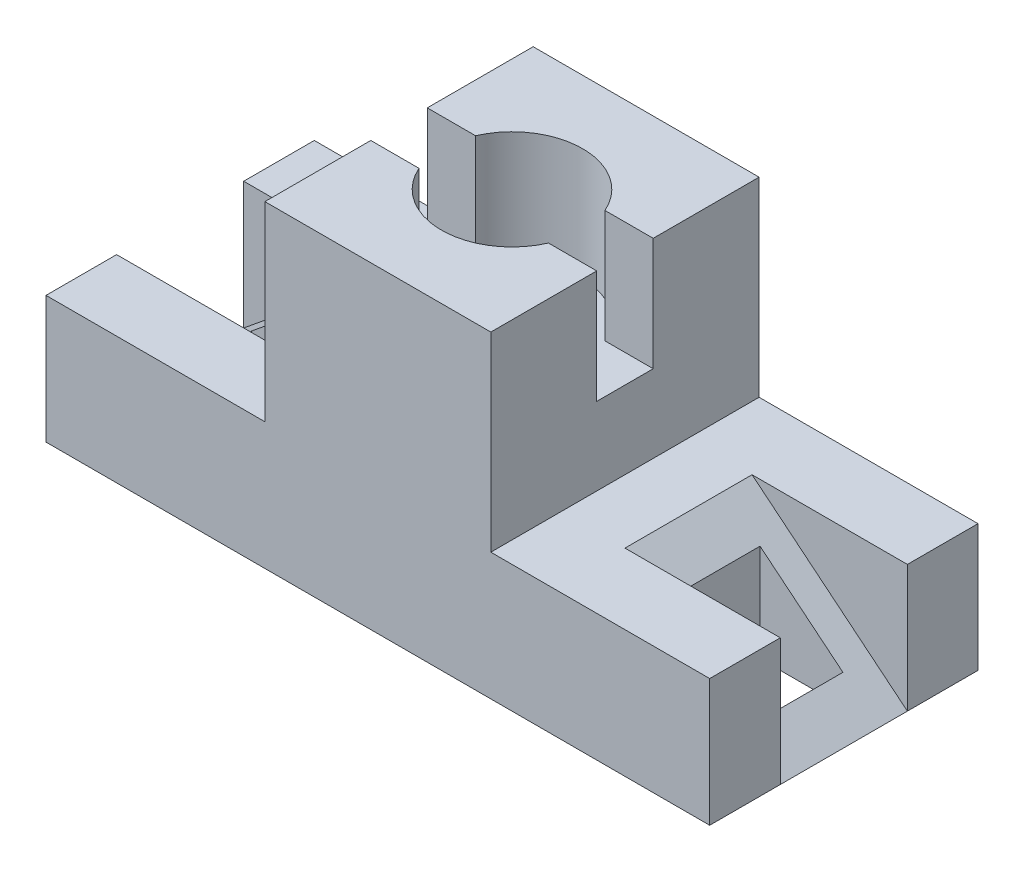
ISO-10303-21;
HEADER;
FILE_DESCRIPTION(('STEP AP214'),'2;1');
FILE_NAME('part.step','',(''),(''),'','','');
FILE_SCHEMA(('AUTOMOTIVE_DESIGN { 1 0 10303 214 1 1 1 1 }'));
ENDSEC;
DATA;
#1=APPLICATION_CONTEXT('core data for automotive mechanical design processes');
#2=APPLICATION_PROTOCOL_DEFINITION('international standard','automotive_design',2000,#1);
#3=PRODUCT_CONTEXT('',#1,'mechanical');
#4=PRODUCT('Part','Part','',(#3));
#5=PRODUCT_RELATED_PRODUCT_CATEGORY('part','',(#4));
#6=PRODUCT_DEFINITION_FORMATION('','',#4);
#7=PRODUCT_DEFINITION_CONTEXT('part definition',#1,'design');
#8=PRODUCT_DEFINITION('design','',#6,#7);
#9=PRODUCT_DEFINITION_SHAPE('','',#8);
#10=(LENGTH_UNIT() NAMED_UNIT(*) SI_UNIT(.MILLI.,.METRE.));
#11=(NAMED_UNIT(*) PLANE_ANGLE_UNIT() SI_UNIT($,.RADIAN.));
#12=(NAMED_UNIT(*) SI_UNIT($,.STERADIAN.) SOLID_ANGLE_UNIT());
#13=UNCERTAINTY_MEASURE_WITH_UNIT(LENGTH_MEASURE(1.E-05),#10,'distance_accuracy_value','');
#14=(GEOMETRIC_REPRESENTATION_CONTEXT(3) GLOBAL_UNCERTAINTY_ASSIGNED_CONTEXT((#13)) GLOBAL_UNIT_ASSIGNED_CONTEXT((#10,
#11,#12)) REPRESENTATION_CONTEXT('',''));
#15=CARTESIAN_POINT('',(0.,0.,0.));
#16=DIRECTION('',(0.,0.,1.));
#17=DIRECTION('',(1.,0.,0.));
#18=AXIS2_PLACEMENT_3D('',#15,#16,#17);
#19=CARTESIAN_POINT('',(94.,0.,38.));
#20=DIRECTION('',(0.,1.,0.));
#21=DIRECTION('',(0.,0.,1.));
#22=AXIS2_PLACEMENT_3D('',#19,#20,#21);
#23=PLANE('',#22);
#24=DIRECTION('',(1.,0.,0.));
#25=VECTOR('',#24,1.);
#26=CARTESIAN_POINT('',(94.,0.,0.));
#27=LINE('',#26,#25);
#28=CARTESIAN_POINT('',(0.,0.,0.));
#29=VERTEX_POINT('',#28);
#30=CARTESIAN_POINT('',(94.,0.,0.));
#31=VERTEX_POINT('',#30);
#32=EDGE_CURVE('E343',#29,#31,#27,.T.);
#33=ORIENTED_EDGE('',*,*,#32,.T.);
#34=DIRECTION('',(0.,0.,-1.));
#35=VECTOR('',#34,1.);
#36=CARTESIAN_POINT('',(94.,0.,38.));
#37=LINE('',#36,#35);
#38=CARTESIAN_POINT('',(94.,0.,10.));
#39=VERTEX_POINT('',#38);
#40=EDGE_CURVE('E423',#39,#31,#37,.T.);
#41=ORIENTED_EDGE('',*,*,#40,.F.);
#42=DIRECTION('',(0.,0.,-1.));
#43=VECTOR('',#42,1.);
#44=CARTESIAN_POINT('',(94.,0.,10.));
#45=LINE('',#44,#43);
#46=CARTESIAN_POINT('',(94.,0.,28.));
#47=VERTEX_POINT('',#46);
#48=EDGE_CURVE('E252',#47,#39,#45,.T.);
#49=ORIENTED_EDGE('',*,*,#48,.F.);
#50=CARTESIAN_POINT('',(94.,0.,38.));
#51=VERTEX_POINT('',#50);
#52=EDGE_CURVE('E424',#51,#47,#37,.T.);
#53=ORIENTED_EDGE('',*,*,#52,.F.);
#54=DIRECTION('',(1.,0.,0.));
#55=VECTOR('',#54,1.);
#56=CARTESIAN_POINT('',(94.,0.,38.));
#57=LINE('',#56,#55);
#58=CARTESIAN_POINT('',(0.,0.,38.));
#59=VERTEX_POINT('',#58);
#60=EDGE_CURVE('E359',#59,#51,#57,.T.);
#61=ORIENTED_EDGE('',*,*,#60,.F.);
#62=DIRECTION('',(0.,0.,-1.));
#63=VECTOR('',#62,1.);
#64=CARTESIAN_POINT('',(0.,0.,38.));
#65=LINE('',#64,#63);
#66=CARTESIAN_POINT('',(0.,0.,28.));
#67=VERTEX_POINT('',#66);
#68=EDGE_CURVE('E398',#59,#67,#65,.T.);
#69=ORIENTED_EDGE('',*,*,#68,.T.);
#70=DIRECTION('',(0.,0.,-1.));
#71=VECTOR('',#70,1.);
#72=CARTESIAN_POINT('',(0.,0.,10.));
#73=LINE('',#72,#71);
#74=CARTESIAN_POINT('',(0.,0.,10.));
#75=VERTEX_POINT('',#74);
#76=EDGE_CURVE('E290',#67,#75,#73,.T.);
#77=ORIENTED_EDGE('',*,*,#76,.T.);
#78=EDGE_CURVE('E377',#75,#29,#65,.T.);
#79=ORIENTED_EDGE('',*,*,#78,.T.);
#80=EDGE_LOOP('',(#33,#41,#49,#53,#61,#69,#77,#79));
#81=FACE_BOUND('',#80,.T.);
#82=DIRECTION('',(1.,0.,0.));
#83=VECTOR('',#82,1.);
#84=CARTESIAN_POINT('',(94.,0.,24.));
#85=LINE('',#84,#83);
#86=CARTESIAN_POINT('',(5.13,0.,24.));
#87=VERTEX_POINT('',#86);
#88=CARTESIAN_POINT('',(16.87,0.,24.));
#89=VERTEX_POINT('',#88);
#90=EDGE_CURVE('E278',#87,#89,#85,.T.);
#91=ORIENTED_EDGE('',*,*,#90,.T.);
#92=DIRECTION('',(0.,0.,-1.));
#93=VECTOR('',#92,1.);
#94=CARTESIAN_POINT('',(16.87,0.,38.));
#95=LINE('',#94,#93);
#96=CARTESIAN_POINT('',(16.87,0.,14.));
#97=VERTEX_POINT('',#96);
#98=EDGE_CURVE('E281',#89,#97,#95,.T.);
#99=ORIENTED_EDGE('',*,*,#98,.T.);
#100=DIRECTION('',(-1.,0.,0.));
#101=VECTOR('',#100,1.);
#102=CARTESIAN_POINT('',(94.,0.,14.));
#103=LINE('',#102,#101);
#104=CARTESIAN_POINT('',(5.13,0.,14.));
#105=VERTEX_POINT('',#104);
#106=EDGE_CURVE('E265',#97,#105,#103,.T.);
#107=ORIENTED_EDGE('',*,*,#106,.T.);
#108=DIRECTION('',(0.,0.,1.));
#109=VECTOR('',#108,1.);
#110=CARTESIAN_POINT('',(5.13,0.,38.));
#111=LINE('',#110,#109);
#112=EDGE_CURVE('E275',#105,#87,#111,.T.);
#113=ORIENTED_EDGE('',*,*,#112,.T.);
#114=EDGE_LOOP('',(#91,#99,#107,#113));
#115=FACE_BOUND('',#114,.T.);
#116=DIRECTION('',(0.,0.,-1.));
#117=VECTOR('',#116,1.);
#118=CARTESIAN_POINT('',(77.13,0.,38.));
#119=LINE('',#118,#117);
#120=CARTESIAN_POINT('',(77.13,0.,24.));
#121=VERTEX_POINT('',#120);
#122=CARTESIAN_POINT('',(77.13,0.,14.));
#123=VERTEX_POINT('',#122);
#124=EDGE_CURVE('E236',#121,#123,#119,.T.);
#125=ORIENTED_EDGE('',*,*,#124,.F.);
#126=DIRECTION('',(-1.,0.,0.));
#127=VECTOR('',#126,1.);
#128=CARTESIAN_POINT('',(94.,0.,24.));
#129=LINE('',#128,#127);
#130=CARTESIAN_POINT('',(88.87,0.,24.));
#131=VERTEX_POINT('',#130);
#132=EDGE_CURVE('E225',#131,#121,#129,.T.);
#133=ORIENTED_EDGE('',*,*,#132,.F.);
#134=DIRECTION('',(0.,0.,1.));
#135=VECTOR('',#134,1.);
#136=CARTESIAN_POINT('',(88.87,0.,38.));
#137=LINE('',#136,#135);
#138=CARTESIAN_POINT('',(88.87,0.,14.));
#139=VERTEX_POINT('',#138);
#140=EDGE_CURVE('E230',#139,#131,#137,.T.);
#141=ORIENTED_EDGE('',*,*,#140,.F.);
#142=DIRECTION('',(1.,0.,0.));
#143=VECTOR('',#142,1.);
#144=CARTESIAN_POINT('',(94.,0.,14.));
#145=LINE('',#144,#143);
#146=EDGE_CURVE('E242',#123,#139,#145,.T.);
#147=ORIENTED_EDGE('',*,*,#146,.F.);
#148=EDGE_LOOP('',(#125,#133,#141,#147));
#149=FACE_BOUND('',#148,.T.);
#150=ADVANCED_FACE('F33',(#81,#115,#149),#23,.F.);
#151=CARTESIAN_POINT('',(94.,0.,0.));
#152=DIRECTION('',(-0.633237790257263,-0.773957299203321,0.));
#153=DIRECTION('',(-0.773957299203321,0.633237790257263,0.));
#154=AXIS2_PLACEMENT_3D('',#151,#152,#153);
#155=PLANE('',#154);
#156=DIRECTION('',(0.,0.,1.));
#157=VECTOR('',#156,1.);
#158=CARTESIAN_POINT('',(72.,18.,28.));
#159=LINE('',#158,#157);
#160=CARTESIAN_POINT('',(72.,18.,10.));
#161=VERTEX_POINT('',#160);
#162=CARTESIAN_POINT('',(72.,18.,28.));
#163=VERTEX_POINT('',#162);
#164=EDGE_CURVE('E243',#161,#163,#159,.T.);
#165=ORIENTED_EDGE('',*,*,#164,.T.);
#166=DIRECTION('',(0.773957299203321,-0.633237790257263,0.));
#167=VECTOR('',#166,1.);
#168=CARTESIAN_POINT('',(94.,0.,28.));
#169=LINE('',#168,#167);
#170=EDGE_CURVE('E254',#163,#47,#169,.T.);
#171=ORIENTED_EDGE('',*,*,#170,.T.);
#172=ORIENTED_EDGE('',*,*,#48,.T.);
#173=DIRECTION('',(-0.773957299203321,0.633237790257263,0.));
#174=VECTOR('',#173,1.);
#175=CARTESIAN_POINT('',(94.,0.,10.));
#176=LINE('',#175,#174);
#177=EDGE_CURVE('E246',#39,#161,#176,.T.);
#178=ORIENTED_EDGE('',*,*,#177,.T.);
#179=EDGE_LOOP('',(#165,#171,#172,#178));
#180=FACE_BOUND('',#179,.T.);
#181=DIRECTION('',(0.,0.,1.));
#182=VECTOR('',#181,1.);
#183=CARTESIAN_POINT('',(77.13,13.8027272727273,0.));
#184=LINE('',#183,#182);
#185=CARTESIAN_POINT('',(77.13,13.8027272727273,14.));
#186=VERTEX_POINT('',#185);
#187=CARTESIAN_POINT('',(77.13,13.8027272727273,24.));
#188=VERTEX_POINT('',#187);
#189=EDGE_CURVE('E11',#186,#188,#184,.T.);
#190=ORIENTED_EDGE('',*,*,#189,.F.);
#191=DIRECTION('',(-0.773957299203321,0.633237790257263,0.));
#192=VECTOR('',#191,1.);
#193=CARTESIAN_POINT('',(94.,0.,14.));
#194=LINE('',#193,#192);
#195=CARTESIAN_POINT('',(88.87,4.19727272727272,14.));
#196=VERTEX_POINT('',#195);
#197=EDGE_CURVE('E40',#196,#186,#194,.T.);
#198=ORIENTED_EDGE('',*,*,#197,.F.);
#199=DIRECTION('',(0.,0.,-1.));
#200=VECTOR('',#199,1.);
#201=CARTESIAN_POINT('',(88.87,4.19727272727273,0.));
#202=LINE('',#201,#200);
#203=CARTESIAN_POINT('',(88.87,4.19727272727274,24.));
#204=VERTEX_POINT('',#203);
#205=EDGE_CURVE('E452',#204,#196,#202,.T.);
#206=ORIENTED_EDGE('',*,*,#205,.F.);
#207=DIRECTION('',(0.773957299203321,-0.633237790257263,0.));
#208=VECTOR('',#207,1.);
#209=CARTESIAN_POINT('',(94.,0.,24.));
#210=LINE('',#209,#208);
#211=EDGE_CURVE('E450',#188,#204,#210,.T.);
#212=ORIENTED_EDGE('',*,*,#211,.F.);
#213=EDGE_LOOP('',(#190,#198,#206,#212));
#214=FACE_BOUND('',#213,.T.);
#215=ADVANCED_FACE('F462',(#180,#214),#155,.F.);
#216=CARTESIAN_POINT('',(94.,18.,38.));
#217=DIRECTION('',(-1.,0.,0.));
#218=DIRECTION('',(0.,0.,1.));
#219=AXIS2_PLACEMENT_3D('',#216,#217,#218);
#220=PLANE('',#219);
#221=DIRECTION('',(0.,-1.,0.));
#222=VECTOR('',#221,1.);
#223=CARTESIAN_POINT('',(94.,18.,28.));
#224=LINE('',#223,#222);
#225=CARTESIAN_POINT('',(94.,18.,28.));
#226=VERTEX_POINT('',#225);
#227=EDGE_CURVE('E259',#226,#47,#224,.T.);
#228=ORIENTED_EDGE('',*,*,#227,.F.);
#229=DIRECTION('',(0.,0.,-1.));
#230=VECTOR('',#229,1.);
#231=CARTESIAN_POINT('',(94.,18.,38.));
#232=LINE('',#231,#230);
#233=CARTESIAN_POINT('',(94.,18.,38.));
#234=VERTEX_POINT('',#233);
#235=EDGE_CURVE('E420',#234,#226,#232,.T.);
#236=ORIENTED_EDGE('',*,*,#235,.F.);
#237=DIRECTION('',(0.,1.,0.));
#238=VECTOR('',#237,1.);
#239=CARTESIAN_POINT('',(94.,18.,38.));
#240=LINE('',#239,#238);
#241=EDGE_CURVE('E362',#51,#234,#240,.T.);
#242=ORIENTED_EDGE('',*,*,#241,.F.);
#243=ORIENTED_EDGE('',*,*,#52,.T.);
#244=EDGE_LOOP('',(#228,#236,#242,#243));
#245=FACE_BOUND('',#244,.T.);
#246=ADVANCED_FACE('F480',(#245),#220,.F.);
#247=DIRECTION('',(0.,1.,0.));
#248=VECTOR('',#247,1.);
#249=CARTESIAN_POINT('',(94.,18.,10.));
#250=LINE('',#249,#248);
#251=CARTESIAN_POINT('',(94.,18.,10.));
#252=VERTEX_POINT('',#251);
#253=EDGE_CURVE('E257',#39,#252,#250,.T.);
#254=ORIENTED_EDGE('',*,*,#253,.F.);
#255=ORIENTED_EDGE('',*,*,#40,.T.);
#256=DIRECTION('',(0.,1.,0.));
#257=VECTOR('',#256,1.);
#258=CARTESIAN_POINT('',(94.,18.,0.));
#259=LINE('',#258,#257);
#260=CARTESIAN_POINT('',(94.,18.,0.));
#261=VERTEX_POINT('',#260);
#262=EDGE_CURVE('E380',#31,#261,#259,.T.);
#263=ORIENTED_EDGE('',*,*,#262,.T.);
#264=EDGE_CURVE('E419',#252,#261,#232,.T.);
#265=ORIENTED_EDGE('',*,*,#264,.F.);
#266=EDGE_LOOP('',(#254,#255,#263,#265));
#267=FACE_BOUND('',#266,.T.);
#268=ADVANCED_FACE('F587',(#267),#220,.F.);
#269=CARTESIAN_POINT('',(63.,18.,38.));
#270=DIRECTION('',(0.,-1.,0.));
#271=DIRECTION('',(0.,0.,-1.));
#272=AXIS2_PLACEMENT_3D('',#269,#270,#271);
#273=PLANE('',#272);
#274=DIRECTION('',(1.,0.,0.));
#275=VECTOR('',#274,1.);
#276=CARTESIAN_POINT('',(63.,18.,28.));
#277=LINE('',#276,#275);
#278=EDGE_CURVE('E448',#163,#226,#277,.T.);
#279=ORIENTED_EDGE('',*,*,#278,.F.);
#280=ORIENTED_EDGE('',*,*,#164,.F.);
#281=DIRECTION('',(-1.,0.,0.));
#282=VECTOR('',#281,1.);
#283=CARTESIAN_POINT('',(63.,18.,10.));
#284=LINE('',#283,#282);
#285=EDGE_CURVE('E445',#252,#161,#284,.T.);
#286=ORIENTED_EDGE('',*,*,#285,.F.);
#287=ORIENTED_EDGE('',*,*,#264,.T.);
#288=DIRECTION('',(-1.,0.,0.));
#289=VECTOR('',#288,1.);
#290=CARTESIAN_POINT('',(63.,18.,0.));
#291=LINE('',#290,#289);
#292=CARTESIAN_POINT('',(63.,18.,0.));
#293=VERTEX_POINT('',#292);
#294=EDGE_CURVE('E383',#261,#293,#291,.T.);
#295=ORIENTED_EDGE('',*,*,#294,.T.);
#296=DIRECTION('',(0.,0.,-1.));
#297=VECTOR('',#296,1.);
#298=CARTESIAN_POINT('',(63.,18.,38.));
#299=LINE('',#298,#297);
#300=CARTESIAN_POINT('',(63.,18.,38.));
#301=VERTEX_POINT('',#300);
#302=EDGE_CURVE('E416',#301,#293,#299,.T.);
#303=ORIENTED_EDGE('',*,*,#302,.F.);
#304=DIRECTION('',(-1.,0.,0.));
#305=VECTOR('',#304,1.);
#306=CARTESIAN_POINT('',(63.,18.,38.));
#307=LINE('',#306,#305);
#308=EDGE_CURVE('E365',#234,#301,#307,.T.);
#309=ORIENTED_EDGE('',*,*,#308,.F.);
#310=ORIENTED_EDGE('',*,*,#235,.T.);
#311=EDGE_LOOP('',(#279,#280,#286,#287,#295,#303,#309,#310));
#312=FACE_BOUND('',#311,.T.);
#313=ADVANCED_FACE('F585',(#312),#273,.F.);
#314=CARTESIAN_POINT('',(0.,0.,38.));
#315=DIRECTION('',(1.,0.,0.));
#316=DIRECTION('',(0.,0.,-1.));
#317=AXIS2_PLACEMENT_3D('',#314,#315,#316);
#318=PLANE('',#317);
#319=ORIENTED_EDGE('',*,*,#78,.F.);
#320=DIRECTION('',(0.,1.,0.));
#321=VECTOR('',#320,1.);
#322=CARTESIAN_POINT('',(0.,0.,10.));
#323=LINE('',#322,#321);
#324=CARTESIAN_POINT('',(0.,18.,10.));
#325=VERTEX_POINT('',#324);
#326=EDGE_CURVE('E430',#75,#325,#323,.T.);
#327=ORIENTED_EDGE('',*,*,#326,.T.);
#328=DIRECTION('',(0.,0.,-1.));
#329=VECTOR('',#328,1.);
#330=CARTESIAN_POINT('',(0.,18.,38.));
#331=LINE('',#330,#329);
#332=CARTESIAN_POINT('',(0.,18.,0.));
#333=VERTEX_POINT('',#332);
#334=EDGE_CURVE('E401',#325,#333,#331,.T.);
#335=ORIENTED_EDGE('',*,*,#334,.T.);
#336=DIRECTION('',(0.,-1.,0.));
#337=VECTOR('',#336,1.);
#338=CARTESIAN_POINT('',(0.,0.,0.));
#339=LINE('',#338,#337);
#340=EDGE_CURVE('E363',#333,#29,#339,.T.);
#341=ORIENTED_EDGE('',*,*,#340,.T.);
#342=EDGE_LOOP('',(#319,#327,#335,#341));
#343=FACE_BOUND('',#342,.T.);
#344=ADVANCED_FACE('F568',(#343),#318,.F.);
#345=CARTESIAN_POINT('',(31.,45.,38.));
#346=DIRECTION('',(0.,-1.,0.));
#347=DIRECTION('',(0.,0.,-1.));
#348=AXIS2_PLACEMENT_3D('',#345,#346,#347);
#349=PLANE('',#348);
#350=DIRECTION('',(-1.,0.,0.));
#351=VECTOR('',#350,1.);
#352=CARTESIAN_POINT('',(0.,45.,23.));
#353=LINE('',#352,#351);
#354=CARTESIAN_POINT('',(37.8348486100883,45.,23.));
#355=VERTEX_POINT('',#354);
#356=CARTESIAN_POINT('',(31.,45.,23.));
#357=VERTEX_POINT('',#356);
#358=EDGE_CURVE('E302',#355,#357,#353,.T.);
#359=ORIENTED_EDGE('',*,*,#358,.T.);
#360=DIRECTION('',(0.,0.,-1.));
#361=VECTOR('',#360,1.);
#362=CARTESIAN_POINT('',(31.,45.,38.));
#363=LINE('',#362,#361);
#364=CARTESIAN_POINT('',(31.,45.,38.));
#365=VERTEX_POINT('',#364);
#366=EDGE_CURVE('E409',#365,#357,#363,.T.);
#367=ORIENTED_EDGE('',*,*,#366,.F.);
#368=DIRECTION('',(-1.,0.,0.));
#369=VECTOR('',#368,1.);
#370=CARTESIAN_POINT('',(31.,45.,38.));
#371=LINE('',#370,#369);
#372=CARTESIAN_POINT('',(63.,45.,38.));
#373=VERTEX_POINT('',#372);
#374=EDGE_CURVE('E369',#373,#365,#371,.T.);
#375=ORIENTED_EDGE('',*,*,#374,.F.);
#376=DIRECTION('',(0.,0.,-1.));
#377=VECTOR('',#376,1.);
#378=CARTESIAN_POINT('',(63.,45.,38.));
#379=LINE('',#378,#377);
#380=CARTESIAN_POINT('',(63.,45.,23.));
#381=VERTEX_POINT('',#380);
#382=EDGE_CURVE('E413',#373,#381,#379,.T.);
#383=ORIENTED_EDGE('',*,*,#382,.T.);
#384=DIRECTION('',(-1.,0.,0.));
#385=VECTOR('',#384,1.);
#386=CARTESIAN_POINT('',(0.,45.,23.));
#387=LINE('',#386,#385);
#388=CARTESIAN_POINT('',(56.1651513899117,45.,23.));
#389=VERTEX_POINT('',#388);
#390=EDGE_CURVE('E331',#381,#389,#387,.T.);
#391=ORIENTED_EDGE('',*,*,#390,.T.);
#392=CARTESIAN_POINT('',(47.,45.,19.));
#393=DIRECTION('',(0.,1.,0.));
#394=DIRECTION('',(0.,0.,1.));
#395=AXIS2_PLACEMENT_3D('',#392,#393,#394);
#396=CIRCLE('',#395,10.);
#397=EDGE_CURVE('E328',#355,#389,#396,.T.);
#398=ORIENTED_EDGE('',*,*,#397,.F.);
#399=EDGE_LOOP('',(#359,#367,#375,#383,#391,#398));
#400=FACE_BOUND('',#399,.T.);
#401=ADVANCED_FACE('F577',(#400),#349,.F.);
#402=CARTESIAN_POINT('',(31.,18.,38.));
#403=DIRECTION('',(1.,0.,0.));
#404=DIRECTION('',(0.,0.,-1.));
#405=AXIS2_PLACEMENT_3D('',#402,#403,#404);
#406=PLANE('',#405);
#407=DIRECTION('',(0.,1.,0.));
#408=VECTOR('',#407,1.);
#409=CARTESIAN_POINT('',(31.,29.,23.));
#410=LINE('',#409,#408);
#411=CARTESIAN_POINT('',(31.,29.,23.));
#412=VERTEX_POINT('',#411);
#413=EDGE_CURVE('E341',#412,#357,#410,.T.);
#414=ORIENTED_EDGE('',*,*,#413,.F.);
#415=DIRECTION('',(0.,0.,1.));
#416=VECTOR('',#415,1.);
#417=CARTESIAN_POINT('',(31.,29.,0.));
#418=LINE('',#417,#416);
#419=CARTESIAN_POINT('',(31.,29.,15.));
#420=VERTEX_POINT('',#419);
#421=EDGE_CURVE('E322',#420,#412,#418,.T.);
#422=ORIENTED_EDGE('',*,*,#421,.F.);
#423=DIRECTION('',(0.,1.,0.));
#424=VECTOR('',#423,1.);
#425=CARTESIAN_POINT('',(31.,29.,15.));
#426=LINE('',#425,#424);
#427=CARTESIAN_POINT('',(31.,45.,15.));
#428=VERTEX_POINT('',#427);
#429=EDGE_CURVE('E344',#420,#428,#426,.T.);
#430=ORIENTED_EDGE('',*,*,#429,.T.);
#431=CARTESIAN_POINT('',(31.,45.,0.));
#432=VERTEX_POINT('',#431);
#433=EDGE_CURVE('E408',#428,#432,#363,.T.);
#434=ORIENTED_EDGE('',*,*,#433,.T.);
#435=DIRECTION('',(0.,-1.,0.));
#436=VECTOR('',#435,1.);
#437=CARTESIAN_POINT('',(31.,18.,0.));
#438=LINE('',#437,#436);
#439=CARTESIAN_POINT('',(31.,18.,0.));
#440=VERTEX_POINT('',#439);
#441=EDGE_CURVE('E391',#432,#440,#438,.T.);
#442=ORIENTED_EDGE('',*,*,#441,.T.);
#443=DIRECTION('',(0.,0.,-1.));
#444=VECTOR('',#443,1.);
#445=CARTESIAN_POINT('',(31.,18.,38.));
#446=LINE('',#445,#444);
#447=CARTESIAN_POINT('',(31.,18.,38.));
#448=VERTEX_POINT('',#447);
#449=EDGE_CURVE('E405',#448,#440,#446,.T.);
#450=ORIENTED_EDGE('',*,*,#449,.F.);
#451=DIRECTION('',(0.,-1.,0.));
#452=VECTOR('',#451,1.);
#453=CARTESIAN_POINT('',(31.,18.,38.));
#454=LINE('',#453,#452);
#455=EDGE_CURVE('E371',#365,#448,#454,.T.);
#456=ORIENTED_EDGE('',*,*,#455,.F.);
#457=ORIENTED_EDGE('',*,*,#366,.T.);
#458=EDGE_LOOP('',(#414,#422,#430,#434,#442,#450,#456,#457));
#459=FACE_BOUND('',#458,.T.);
#460=ADVANCED_FACE('F573',(#459),#406,.F.);
#461=CARTESIAN_POINT('',(63.,45.,38.));
#462=DIRECTION('',(-1.,0.,0.));
#463=DIRECTION('',(0.,0.,1.));
#464=AXIS2_PLACEMENT_3D('',#461,#462,#463);
#465=PLANE('',#464);
#466=CARTESIAN_POINT('',(63.,45.,15.));
#467=VERTEX_POINT('',#466);
#468=CARTESIAN_POINT('',(63.,45.,0.));
#469=VERTEX_POINT('',#468);
#470=EDGE_CURVE('E412',#467,#469,#379,.T.);
#471=ORIENTED_EDGE('',*,*,#470,.F.);
#472=DIRECTION('',(0.,1.,0.));
#473=VECTOR('',#472,1.);
#474=CARTESIAN_POINT('',(63.,29.,15.));
#475=LINE('',#474,#473);
#476=CARTESIAN_POINT('',(63.,29.,15.));
#477=VERTEX_POINT('',#476);
#478=EDGE_CURVE('E351',#477,#467,#475,.T.);
#479=ORIENTED_EDGE('',*,*,#478,.F.);
#480=DIRECTION('',(0.,0.,-1.));
#481=VECTOR('',#480,1.);
#482=CARTESIAN_POINT('',(63.,29.,0.));
#483=LINE('',#482,#481);
#484=CARTESIAN_POINT('',(63.,29.,23.));
#485=VERTEX_POINT('',#484);
#486=EDGE_CURVE('E311',#485,#477,#483,.T.);
#487=ORIENTED_EDGE('',*,*,#486,.F.);
#488=DIRECTION('',(0.,1.,0.));
#489=VECTOR('',#488,1.);
#490=CARTESIAN_POINT('',(63.,29.,23.));
#491=LINE('',#490,#489);
#492=EDGE_CURVE('E353',#485,#381,#491,.T.);
#493=ORIENTED_EDGE('',*,*,#492,.T.);
#494=ORIENTED_EDGE('',*,*,#382,.F.);
#495=DIRECTION('',(0.,1.,0.));
#496=VECTOR('',#495,1.);
#497=CARTESIAN_POINT('',(63.,45.,38.));
#498=LINE('',#497,#496);
#499=EDGE_CURVE('E367',#301,#373,#498,.T.);
#500=ORIENTED_EDGE('',*,*,#499,.F.);
#501=ORIENTED_EDGE('',*,*,#302,.T.);
#502=DIRECTION('',(0.,1.,0.));
#503=VECTOR('',#502,1.);
#504=CARTESIAN_POINT('',(63.,45.,0.));
#505=LINE('',#504,#503);
#506=EDGE_CURVE('E385',#293,#469,#505,.T.);
#507=ORIENTED_EDGE('',*,*,#506,.T.);
#508=EDGE_LOOP('',(#471,#479,#487,#493,#494,#500,#501,#507));
#509=FACE_BOUND('',#508,.T.);
#510=ADVANCED_FACE('F576',(#509),#465,.F.);
#511=ORIENTED_EDGE('',*,*,#433,.F.);
#512=DIRECTION('',(-1.,0.,0.));
#513=VECTOR('',#512,1.);
#514=CARTESIAN_POINT('',(0.,45.,15.));
#515=LINE('',#514,#513);
#516=CARTESIAN_POINT('',(37.8348486100883,45.,15.));
#517=VERTEX_POINT('',#516);
#518=EDGE_CURVE('E306',#517,#428,#515,.T.);
#519=ORIENTED_EDGE('',*,*,#518,.F.);
#520=CARTESIAN_POINT('',(47.,45.,19.));
#521=DIRECTION('',(0.,1.,0.));
#522=DIRECTION('',(0.,0.,1.));
#523=AXIS2_PLACEMENT_3D('',#520,#521,#522);
#524=CIRCLE('',#523,10.);
#525=CARTESIAN_POINT('',(56.1651513899117,45.,15.));
#526=VERTEX_POINT('',#525);
#527=EDGE_CURVE('E337',#526,#517,#524,.T.);
#528=ORIENTED_EDGE('',*,*,#527,.F.);
#529=DIRECTION('',(-1.,0.,0.));
#530=VECTOR('',#529,1.);
#531=CARTESIAN_POINT('',(0.,45.,15.));
#532=LINE('',#531,#530);
#533=EDGE_CURVE('E334',#467,#526,#532,.T.);
#534=ORIENTED_EDGE('',*,*,#533,.F.);
#535=ORIENTED_EDGE('',*,*,#470,.T.);
#536=DIRECTION('',(-1.,0.,0.));
#537=VECTOR('',#536,1.);
#538=CARTESIAN_POINT('',(31.,45.,0.));
#539=LINE('',#538,#537);
#540=EDGE_CURVE('E388',#469,#432,#539,.T.);
#541=ORIENTED_EDGE('',*,*,#540,.T.);
#542=EDGE_LOOP('',(#511,#519,#528,#534,#535,#541));
#543=FACE_BOUND('',#542,.T.);
#544=ADVANCED_FACE('F571',(#543),#349,.F.);
#545=CARTESIAN_POINT('',(0.,18.,38.));
#546=DIRECTION('',(0.,-1.,0.));
#547=DIRECTION('',(0.,0.,-1.));
#548=AXIS2_PLACEMENT_3D('',#545,#546,#547);
#549=PLANE('',#548);
#550=ORIENTED_EDGE('',*,*,#334,.F.);
#551=DIRECTION('',(1.,0.,0.));
#552=VECTOR('',#551,1.);
#553=CARTESIAN_POINT('',(0.,18.,10.));
#554=LINE('',#553,#552);
#555=CARTESIAN_POINT('',(22.,18.,10.));
#556=VERTEX_POINT('',#555);
#557=EDGE_CURVE('E299',#325,#556,#554,.T.);
#558=ORIENTED_EDGE('',*,*,#557,.T.);
#559=DIRECTION('',(0.,0.,1.));
#560=VECTOR('',#559,1.);
#561=CARTESIAN_POINT('',(22.,18.,28.));
#562=LINE('',#561,#560);
#563=CARTESIAN_POINT('',(22.,18.,28.));
#564=VERTEX_POINT('',#563);
#565=EDGE_CURVE('E284',#556,#564,#562,.T.);
#566=ORIENTED_EDGE('',*,*,#565,.T.);
#567=DIRECTION('',(-1.,0.,0.));
#568=VECTOR('',#567,1.);
#569=CARTESIAN_POINT('',(0.,18.,28.));
#570=LINE('',#569,#568);
#571=CARTESIAN_POINT('',(0.,18.,28.));
#572=VERTEX_POINT('',#571);
#573=EDGE_CURVE('E296',#564,#572,#570,.T.);
#574=ORIENTED_EDGE('',*,*,#573,.T.);
#575=CARTESIAN_POINT('',(0.,18.,38.));
#576=VERTEX_POINT('',#575);
#577=EDGE_CURVE('E402',#576,#572,#331,.T.);
#578=ORIENTED_EDGE('',*,*,#577,.F.);
#579=DIRECTION('',(-1.,0.,0.));
#580=VECTOR('',#579,1.);
#581=CARTESIAN_POINT('',(0.,18.,38.));
#582=LINE('',#581,#580);
#583=EDGE_CURVE('E373',#448,#576,#582,.T.);
#584=ORIENTED_EDGE('',*,*,#583,.F.);
#585=ORIENTED_EDGE('',*,*,#449,.T.);
#586=DIRECTION('',(-1.,0.,0.));
#587=VECTOR('',#586,1.);
#588=CARTESIAN_POINT('',(0.,18.,0.));
#589=LINE('',#588,#587);
#590=EDGE_CURVE('E393',#440,#333,#589,.T.);
#591=ORIENTED_EDGE('',*,*,#590,.T.);
#592=EDGE_LOOP('',(#550,#558,#566,#574,#578,#584,#585,#591));
#593=FACE_BOUND('',#592,.T.);
#594=ADVANCED_FACE('F566',(#593),#549,.F.);
#595=ORIENTED_EDGE('',*,*,#577,.T.);
#596=DIRECTION('',(0.,-1.,0.));
#597=VECTOR('',#596,1.);
#598=CARTESIAN_POINT('',(0.,0.,28.));
#599=LINE('',#598,#597);
#600=EDGE_CURVE('E427',#572,#67,#599,.T.);
#601=ORIENTED_EDGE('',*,*,#600,.T.);
#602=ORIENTED_EDGE('',*,*,#68,.F.);
#603=DIRECTION('',(0.,-1.,0.));
#604=VECTOR('',#603,1.);
#605=CARTESIAN_POINT('',(0.,0.,38.));
#606=LINE('',#605,#604);
#607=EDGE_CURVE('E375',#576,#59,#606,.T.);
#608=ORIENTED_EDGE('',*,*,#607,.F.);
#609=EDGE_LOOP('',(#595,#601,#602,#608));
#610=FACE_BOUND('',#609,.T.);
#611=ADVANCED_FACE('F559',(#610),#318,.F.);
#612=CARTESIAN_POINT('',(0.,0.,38.));
#613=DIRECTION('',(0.,0.,-1.));
#614=DIRECTION('',(-1.,0.,0.));
#615=AXIS2_PLACEMENT_3D('',#612,#613,#614);
#616=PLANE('',#615);
#617=ORIENTED_EDGE('',*,*,#60,.T.);
#618=ORIENTED_EDGE('',*,*,#241,.T.);
#619=ORIENTED_EDGE('',*,*,#308,.T.);
#620=ORIENTED_EDGE('',*,*,#499,.T.);
#621=ORIENTED_EDGE('',*,*,#374,.T.);
#622=ORIENTED_EDGE('',*,*,#455,.T.);
#623=ORIENTED_EDGE('',*,*,#583,.T.);
#624=ORIENTED_EDGE('',*,*,#607,.T.);
#625=EDGE_LOOP('',(#617,#618,#619,#620,#621,#622,#623,#624));
#626=FACE_BOUND('',#625,.T.);
#627=ADVANCED_FACE('F556',(#626),#616,.F.);
#628=CARTESIAN_POINT('',(0.,0.,0.));
#629=DIRECTION('',(0.,0.,-1.));
#630=DIRECTION('',(-1.,0.,0.));
#631=AXIS2_PLACEMENT_3D('',#628,#629,#630);
#632=PLANE('',#631);
#633=ORIENTED_EDGE('',*,*,#32,.F.);
#634=ORIENTED_EDGE('',*,*,#340,.F.);
#635=ORIENTED_EDGE('',*,*,#590,.F.);
#636=ORIENTED_EDGE('',*,*,#441,.F.);
#637=ORIENTED_EDGE('',*,*,#540,.F.);
#638=ORIENTED_EDGE('',*,*,#506,.F.);
#639=ORIENTED_EDGE('',*,*,#294,.F.);
#640=ORIENTED_EDGE('',*,*,#262,.F.);
#641=EDGE_LOOP('',(#633,#634,#635,#636,#637,#638,#639,#640));
#642=FACE_BOUND('',#641,.T.);
#643=ADVANCED_FACE('F554',(#642),#632,.T.);
#644=CARTESIAN_POINT('',(0.,29.,23.));
#645=DIRECTION('',(0.,0.,-1.));
#646=DIRECTION('',(-1.,0.,0.));
#647=AXIS2_PLACEMENT_3D('',#644,#645,#646);
#648=PLANE('',#647);
#649=ORIENTED_EDGE('',*,*,#358,.F.);
#650=DIRECTION('',(0.,1.,0.));
#651=VECTOR('',#650,1.);
#652=CARTESIAN_POINT('',(37.8348486100883,29.,23.));
#653=LINE('',#652,#651);
#654=CARTESIAN_POINT('',(37.8348486100883,29.,23.));
#655=VERTEX_POINT('',#654);
#656=EDGE_CURVE('E325',#655,#355,#653,.T.);
#657=ORIENTED_EDGE('',*,*,#656,.F.);
#658=DIRECTION('',(-1.,0.,0.));
#659=VECTOR('',#658,1.);
#660=CARTESIAN_POINT('',(0.,29.,23.));
#661=LINE('',#660,#659);
#662=EDGE_CURVE('E303',#655,#412,#661,.T.);
#663=ORIENTED_EDGE('',*,*,#662,.T.);
#664=ORIENTED_EDGE('',*,*,#413,.T.);
#665=EDGE_LOOP('',(#649,#657,#663,#664));
#666=FACE_BOUND('',#665,.T.);
#667=ADVANCED_FACE('F536',(#666),#648,.T.);
#668=CARTESIAN_POINT('',(0.,29.,15.));
#669=DIRECTION('',(0.,0.,-1.));
#670=DIRECTION('',(-1.,0.,0.));
#671=AXIS2_PLACEMENT_3D('',#668,#669,#670);
#672=PLANE('',#671);
#673=ORIENTED_EDGE('',*,*,#518,.T.);
#674=ORIENTED_EDGE('',*,*,#429,.F.);
#675=DIRECTION('',(-1.,0.,0.));
#676=VECTOR('',#675,1.);
#677=CARTESIAN_POINT('',(0.,29.,15.));
#678=LINE('',#677,#676);
#679=CARTESIAN_POINT('',(37.8348486100883,29.,15.));
#680=VERTEX_POINT('',#679);
#681=EDGE_CURVE('E320',#680,#420,#678,.T.);
#682=ORIENTED_EDGE('',*,*,#681,.F.);
#683=DIRECTION('',(0.,1.,0.));
#684=VECTOR('',#683,1.);
#685=CARTESIAN_POINT('',(37.8348486100883,29.,15.));
#686=LINE('',#685,#684);
#687=EDGE_CURVE('E347',#680,#517,#686,.T.);
#688=ORIENTED_EDGE('',*,*,#687,.T.);
#689=EDGE_LOOP('',(#673,#674,#682,#688));
#690=FACE_BOUND('',#689,.T.);
#691=ADVANCED_FACE('F532',(#690),#672,.F.);
#692=CARTESIAN_POINT('',(47.,29.,19.));
#693=DIRECTION('',(0.,1.,0.));
#694=DIRECTION('',(0.,0.,1.));
#695=AXIS2_PLACEMENT_3D('',#692,#693,#694);
#696=CYLINDRICAL_SURFACE('',#695,10.);
#697=ORIENTED_EDGE('',*,*,#527,.T.);
#698=ORIENTED_EDGE('',*,*,#687,.F.);
#699=CARTESIAN_POINT('',(47.,29.,19.));
#700=DIRECTION('',(0.,1.,0.));
#701=DIRECTION('',(0.,0.,1.));
#702=AXIS2_PLACEMENT_3D('',#699,#700,#701);
#703=CIRCLE('',#702,10.);
#704=CARTESIAN_POINT('',(56.1651513899117,29.,15.));
#705=VERTEX_POINT('',#704);
#706=EDGE_CURVE('E317',#705,#680,#703,.T.);
#707=ORIENTED_EDGE('',*,*,#706,.F.);
#708=DIRECTION('',(0.,1.,0.));
#709=VECTOR('',#708,1.);
#710=CARTESIAN_POINT('',(56.1651513899117,29.,15.));
#711=LINE('',#710,#709);
#712=EDGE_CURVE('E349',#705,#526,#711,.T.);
#713=ORIENTED_EDGE('',*,*,#712,.T.);
#714=EDGE_LOOP('',(#697,#698,#707,#713));
#715=FACE_BOUND('',#714,.T.);
#716=ADVANCED_FACE('F535',(#715),#696,.F.);
#717=CARTESIAN_POINT('',(0.,29.,15.));
#718=DIRECTION('',(0.,0.,-1.));
#719=DIRECTION('',(-1.,0.,0.));
#720=AXIS2_PLACEMENT_3D('',#717,#718,#719);
#721=PLANE('',#720);
#722=ORIENTED_EDGE('',*,*,#533,.T.);
#723=ORIENTED_EDGE('',*,*,#712,.F.);
#724=DIRECTION('',(-1.,0.,0.));
#725=VECTOR('',#724,1.);
#726=CARTESIAN_POINT('',(0.,29.,15.));
#727=LINE('',#726,#725);
#728=EDGE_CURVE('E314',#477,#705,#727,.T.);
#729=ORIENTED_EDGE('',*,*,#728,.F.);
#730=ORIENTED_EDGE('',*,*,#478,.T.);
#731=EDGE_LOOP('',(#722,#723,#729,#730));
#732=FACE_BOUND('',#731,.T.);
#733=ADVANCED_FACE('F540',(#732),#721,.F.);
#734=CARTESIAN_POINT('',(0.,29.,23.));
#735=DIRECTION('',(0.,0.,-1.));
#736=DIRECTION('',(-1.,0.,0.));
#737=AXIS2_PLACEMENT_3D('',#734,#735,#736);
#738=PLANE('',#737);
#739=ORIENTED_EDGE('',*,*,#390,.F.);
#740=ORIENTED_EDGE('',*,*,#492,.F.);
#741=DIRECTION('',(-1.,0.,0.));
#742=VECTOR('',#741,1.);
#743=CARTESIAN_POINT('',(0.,29.,23.));
#744=LINE('',#743,#742);
#745=CARTESIAN_POINT('',(56.1651513899117,29.,23.));
#746=VERTEX_POINT('',#745);
#747=EDGE_CURVE('E309',#485,#746,#744,.T.);
#748=ORIENTED_EDGE('',*,*,#747,.T.);
#749=DIRECTION('',(0.,1.,0.));
#750=VECTOR('',#749,1.);
#751=CARTESIAN_POINT('',(56.1651513899117,29.,23.));
#752=LINE('',#751,#750);
#753=EDGE_CURVE('E356',#746,#389,#752,.T.);
#754=ORIENTED_EDGE('',*,*,#753,.T.);
#755=EDGE_LOOP('',(#739,#740,#748,#754));
#756=FACE_BOUND('',#755,.T.);
#757=ADVANCED_FACE('F544',(#756),#738,.T.);
#758=CARTESIAN_POINT('',(47.,29.,19.));
#759=DIRECTION('',(0.,1.,0.));
#760=DIRECTION('',(0.,0.,1.));
#761=AXIS2_PLACEMENT_3D('',#758,#759,#760);
#762=CYLINDRICAL_SURFACE('',#761,10.);
#763=ORIENTED_EDGE('',*,*,#397,.T.);
#764=ORIENTED_EDGE('',*,*,#753,.F.);
#765=CARTESIAN_POINT('',(47.,29.,19.));
#766=DIRECTION('',(0.,1.,0.));
#767=DIRECTION('',(0.,0.,1.));
#768=AXIS2_PLACEMENT_3D('',#765,#766,#767);
#769=CIRCLE('',#768,10.);
#770=EDGE_CURVE('E305',#655,#746,#769,.T.);
#771=ORIENTED_EDGE('',*,*,#770,.F.);
#772=ORIENTED_EDGE('',*,*,#656,.T.);
#773=EDGE_LOOP('',(#763,#764,#771,#772));
#774=FACE_BOUND('',#773,.T.);
#775=ADVANCED_FACE('F530',(#774),#762,.F.);
#776=CARTESIAN_POINT('',(0.,29.,0.));
#777=DIRECTION('',(0.,1.,0.));
#778=DIRECTION('',(0.,0.,1.));
#779=AXIS2_PLACEMENT_3D('',#776,#777,#778);
#780=PLANE('',#779);
#781=ORIENTED_EDGE('',*,*,#662,.F.);
#782=ORIENTED_EDGE('',*,*,#770,.T.);
#783=ORIENTED_EDGE('',*,*,#747,.F.);
#784=ORIENTED_EDGE('',*,*,#486,.T.);
#785=ORIENTED_EDGE('',*,*,#728,.T.);
#786=ORIENTED_EDGE('',*,*,#706,.T.);
#787=ORIENTED_EDGE('',*,*,#681,.T.);
#788=ORIENTED_EDGE('',*,*,#421,.T.);
#789=EDGE_LOOP('',(#781,#782,#783,#784,#785,#786,#787,#788));
#790=FACE_BOUND('',#789,.T.);
#791=ADVANCED_FACE('F523',(#790),#780,.T.);
#792=CARTESIAN_POINT('',(-29.1289383518341,35.6020357633528,10.));
#793=DIRECTION('',(0.,0.,-1.));
#794=DIRECTION('',(-1.,0.,0.));
#795=AXIS2_PLACEMENT_3D('',#792,#793,#794);
#796=PLANE('',#795);
#797=ORIENTED_EDGE('',*,*,#326,.F.);
#798=DIRECTION('',(0.773957299203321,0.633237790257263,0.));
#799=VECTOR('',#798,1.);
#800=CARTESIAN_POINT('',(0.,0.,10.));
#801=LINE('',#800,#799);
#802=EDGE_CURVE('E293',#75,#556,#801,.T.);
#803=ORIENTED_EDGE('',*,*,#802,.T.);
#804=ORIENTED_EDGE('',*,*,#557,.F.);
#805=EDGE_LOOP('',(#797,#803,#804));
#806=FACE_BOUND('',#805,.T.);
#807=ADVANCED_FACE('F520',(#806),#796,.F.);
#808=CARTESIAN_POINT('',(-29.1289383518341,35.6020357633528,28.));
#809=DIRECTION('',(0.,0.,1.));
#810=DIRECTION('',(1.,0.,0.));
#811=AXIS2_PLACEMENT_3D('',#808,#809,#810);
#812=PLANE('',#811);
#813=DIRECTION('',(-0.773957299203321,-0.633237790257263,0.));
#814=VECTOR('',#813,1.);
#815=CARTESIAN_POINT('',(0.,0.,28.));
#816=LINE('',#815,#814);
#817=EDGE_CURVE('E287',#564,#67,#816,.T.);
#818=ORIENTED_EDGE('',*,*,#817,.T.);
#819=ORIENTED_EDGE('',*,*,#600,.F.);
#820=ORIENTED_EDGE('',*,*,#573,.F.);
#821=EDGE_LOOP('',(#818,#819,#820));
#822=FACE_BOUND('',#821,.T.);
#823=ADVANCED_FACE('F519',(#822),#812,.F.);
#824=CARTESIAN_POINT('',(0.,0.,0.));
#825=DIRECTION('',(0.633237790257263,-0.773957299203321,0.));
#826=DIRECTION('',(0.773957299203321,0.633237790257263,0.));
#827=AXIS2_PLACEMENT_3D('',#824,#825,#826);
#828=PLANE('',#827);
#829=DIRECTION('',(0.773957299203321,0.633237790257263,0.));
#830=VECTOR('',#829,1.);
#831=CARTESIAN_POINT('',(0.,0.,14.));
#832=LINE('',#831,#830);
#833=CARTESIAN_POINT('',(5.13,4.19727272727275,14.));
#834=VERTEX_POINT('',#833);
#835=CARTESIAN_POINT('',(16.87,13.8027272727273,14.));
#836=VERTEX_POINT('',#835);
#837=EDGE_CURVE('E433',#834,#836,#832,.T.);
#838=ORIENTED_EDGE('',*,*,#837,.T.);
#839=DIRECTION('',(0.,0.,1.));
#840=VECTOR('',#839,1.);
#841=CARTESIAN_POINT('',(16.87,13.8027272727273,0.));
#842=LINE('',#841,#840);
#843=CARTESIAN_POINT('',(16.87,13.8027272727273,24.));
#844=VERTEX_POINT('',#843);
#845=EDGE_CURVE('E442',#836,#844,#842,.T.);
#846=ORIENTED_EDGE('',*,*,#845,.T.);
#847=DIRECTION('',(-0.773957299203321,-0.633237790257263,0.));
#848=VECTOR('',#847,1.);
#849=CARTESIAN_POINT('',(0.,0.,24.));
#850=LINE('',#849,#848);
#851=CARTESIAN_POINT('',(5.13,4.19727272727273,24.));
#852=VERTEX_POINT('',#851);
#853=EDGE_CURVE('E439',#844,#852,#850,.T.);
#854=ORIENTED_EDGE('',*,*,#853,.T.);
#855=DIRECTION('',(0.,0.,-1.));
#856=VECTOR('',#855,1.);
#857=CARTESIAN_POINT('',(5.13,4.19727272727273,0.));
#858=LINE('',#857,#856);
#859=EDGE_CURVE('E436',#852,#834,#858,.T.);
#860=ORIENTED_EDGE('',*,*,#859,.T.);
#861=EDGE_LOOP('',(#838,#846,#854,#860));
#862=FACE_BOUND('',#861,.T.);
#863=ORIENTED_EDGE('',*,*,#565,.F.);
#864=ORIENTED_EDGE('',*,*,#802,.F.);
#865=ORIENTED_EDGE('',*,*,#76,.F.);
#866=ORIENTED_EDGE('',*,*,#817,.F.);
#867=EDGE_LOOP('',(#863,#864,#865,#866));
#868=FACE_BOUND('',#867,.T.);
#869=ADVANCED_FACE('F494',(#862,#868),#828,.F.);
#870=CARTESIAN_POINT('',(16.87,-58.,24.));
#871=DIRECTION('',(1.,0.,0.));
#872=DIRECTION('',(0.,0.,-1.));
#873=AXIS2_PLACEMENT_3D('',#870,#871,#872);
#874=PLANE('',#873);
#875=DIRECTION('',(0.,1.,0.));
#876=VECTOR('',#875,1.);
#877=CARTESIAN_POINT('',(16.87,-58.,24.));
#878=LINE('',#877,#876);
#879=EDGE_CURVE('E262',#89,#844,#878,.T.);
#880=ORIENTED_EDGE('',*,*,#879,.T.);
#881=ORIENTED_EDGE('',*,*,#845,.F.);
#882=DIRECTION('',(0.,1.,0.));
#883=VECTOR('',#882,1.);
#884=CARTESIAN_POINT('',(16.87,-58.,14.));
#885=LINE('',#884,#883);
#886=EDGE_CURVE('E261',#97,#836,#885,.T.);
#887=ORIENTED_EDGE('',*,*,#886,.F.);
#888=ORIENTED_EDGE('',*,*,#98,.F.);
#889=EDGE_LOOP('',(#880,#881,#887,#888));
#890=FACE_BOUND('',#889,.T.);
#891=ADVANCED_FACE('F498',(#890),#874,.F.);
#892=CARTESIAN_POINT('',(5.13,-58.,24.));
#893=DIRECTION('',(0.,0.,1.));
#894=DIRECTION('',(1.,0.,0.));
#895=AXIS2_PLACEMENT_3D('',#892,#893,#894);
#896=PLANE('',#895);
#897=DIRECTION('',(0.,1.,0.));
#898=VECTOR('',#897,1.);
#899=CARTESIAN_POINT('',(5.13,-58.,24.));
#900=LINE('',#899,#898);
#901=EDGE_CURVE('E266',#87,#852,#900,.T.);
#902=ORIENTED_EDGE('',*,*,#901,.T.);
#903=ORIENTED_EDGE('',*,*,#853,.F.);
#904=ORIENTED_EDGE('',*,*,#879,.F.);
#905=ORIENTED_EDGE('',*,*,#90,.F.);
#906=EDGE_LOOP('',(#902,#903,#904,#905));
#907=FACE_BOUND('',#906,.T.);
#908=ADVANCED_FACE('F490',(#907),#896,.F.);
#909=CARTESIAN_POINT('',(5.13,-58.,14.));
#910=DIRECTION('',(-1.,0.,0.));
#911=DIRECTION('',(0.,0.,1.));
#912=AXIS2_PLACEMENT_3D('',#909,#910,#911);
#913=PLANE('',#912);
#914=DIRECTION('',(0.,1.,0.));
#915=VECTOR('',#914,1.);
#916=CARTESIAN_POINT('',(5.13,-58.,14.));
#917=LINE('',#916,#915);
#918=EDGE_CURVE('E269',#105,#834,#917,.T.);
#919=ORIENTED_EDGE('',*,*,#918,.T.);
#920=ORIENTED_EDGE('',*,*,#859,.F.);
#921=ORIENTED_EDGE('',*,*,#901,.F.);
#922=ORIENTED_EDGE('',*,*,#112,.F.);
#923=EDGE_LOOP('',(#919,#920,#921,#922));
#924=FACE_BOUND('',#923,.T.);
#925=ADVANCED_FACE('F492',(#924),#913,.F.);
#926=CARTESIAN_POINT('',(5.13,-58.,14.));
#927=DIRECTION('',(0.,0.,-1.));
#928=DIRECTION('',(-1.,0.,0.));
#929=AXIS2_PLACEMENT_3D('',#926,#927,#928);
#930=PLANE('',#929);
#931=ORIENTED_EDGE('',*,*,#886,.T.);
#932=ORIENTED_EDGE('',*,*,#837,.F.);
#933=ORIENTED_EDGE('',*,*,#918,.F.);
#934=ORIENTED_EDGE('',*,*,#106,.F.);
#935=EDGE_LOOP('',(#931,#932,#933,#934));
#936=FACE_BOUND('',#935,.T.);
#937=ADVANCED_FACE('F501',(#936),#930,.F.);
#938=CARTESIAN_POINT('',(123.128938351834,35.6020357633528,28.));
#939=DIRECTION('',(0.,0.,-1.));
#940=DIRECTION('',(-1.,0.,0.));
#941=AXIS2_PLACEMENT_3D('',#938,#939,#940);
#942=PLANE('',#941);
#943=ORIENTED_EDGE('',*,*,#227,.T.);
#944=ORIENTED_EDGE('',*,*,#170,.F.);
#945=ORIENTED_EDGE('',*,*,#278,.T.);
#946=EDGE_LOOP('',(#943,#944,#945));
#947=FACE_BOUND('',#946,.T.);
#948=ADVANCED_FACE('F503',(#947),#942,.T.);
#949=CARTESIAN_POINT('',(123.128938351834,35.6020357633528,10.));
#950=DIRECTION('',(0.,0.,1.));
#951=DIRECTION('',(1.,0.,0.));
#952=AXIS2_PLACEMENT_3D('',#949,#950,#951);
#953=PLANE('',#952);
#954=ORIENTED_EDGE('',*,*,#253,.T.);
#955=ORIENTED_EDGE('',*,*,#285,.T.);
#956=ORIENTED_EDGE('',*,*,#177,.F.);
#957=EDGE_LOOP('',(#954,#955,#956));
#958=FACE_BOUND('',#957,.T.);
#959=ADVANCED_FACE('F509',(#958),#953,.T.);
#960=CARTESIAN_POINT('',(77.13,-58.,24.));
#961=DIRECTION('',(1.,0.,0.));
#962=DIRECTION('',(0.,0.,-1.));
#963=AXIS2_PLACEMENT_3D('',#960,#961,#962);
#964=PLANE('',#963);
#965=ORIENTED_EDGE('',*,*,#124,.T.);
#966=DIRECTION('',(0.,1.,0.));
#967=VECTOR('',#966,1.);
#968=CARTESIAN_POINT('',(77.13,-58.,14.));
#969=LINE('',#968,#967);
#970=EDGE_CURVE('E231',#123,#186,#969,.T.);
#971=ORIENTED_EDGE('',*,*,#970,.T.);
#972=ORIENTED_EDGE('',*,*,#189,.T.);
#973=DIRECTION('',(0.,1.,0.));
#974=VECTOR('',#973,1.);
#975=CARTESIAN_POINT('',(77.13,-58.,24.));
#976=LINE('',#975,#974);
#977=EDGE_CURVE('E52',#121,#188,#976,.T.);
#978=ORIENTED_EDGE('',*,*,#977,.F.);
#979=EDGE_LOOP('',(#965,#971,#972,#978));
#980=FACE_BOUND('',#979,.T.);
#981=ADVANCED_FACE('F234',(#980),#964,.T.);
#982=CARTESIAN_POINT('',(88.87,-58.,14.));
#983=DIRECTION('',(0.,0.,1.));
#984=DIRECTION('',(1.,0.,0.));
#985=AXIS2_PLACEMENT_3D('',#982,#983,#984);
#986=PLANE('',#985);
#987=ORIENTED_EDGE('',*,*,#146,.T.);
#988=DIRECTION('',(0.,1.,0.));
#989=VECTOR('',#988,1.);
#990=CARTESIAN_POINT('',(88.87,-58.,14.));
#991=LINE('',#990,#989);
#992=EDGE_CURVE('E458',#139,#196,#991,.T.);
#993=ORIENTED_EDGE('',*,*,#992,.T.);
#994=ORIENTED_EDGE('',*,*,#197,.T.);
#995=ORIENTED_EDGE('',*,*,#970,.F.);
#996=EDGE_LOOP('',(#987,#993,#994,#995));
#997=FACE_BOUND('',#996,.T.);
#998=ADVANCED_FACE('F456',(#997),#986,.T.);
#999=CARTESIAN_POINT('',(88.87,-58.,14.));
#1000=DIRECTION('',(-1.,0.,0.));
#1001=DIRECTION('',(0.,0.,1.));
#1002=AXIS2_PLACEMENT_3D('',#999,#1000,#1001);
#1003=PLANE('',#1002);
#1004=ORIENTED_EDGE('',*,*,#140,.T.);
#1005=DIRECTION('',(0.,1.,0.));
#1006=VECTOR('',#1005,1.);
#1007=CARTESIAN_POINT('',(88.87,-58.,24.));
#1008=LINE('',#1007,#1006);
#1009=EDGE_CURVE('E47',#131,#204,#1008,.T.);
#1010=ORIENTED_EDGE('',*,*,#1009,.T.);
#1011=ORIENTED_EDGE('',*,*,#205,.T.);
#1012=ORIENTED_EDGE('',*,*,#992,.F.);
#1013=EDGE_LOOP('',(#1004,#1010,#1011,#1012));
#1014=FACE_BOUND('',#1013,.T.);
#1015=ADVANCED_FACE('F464',(#1014),#1003,.T.);
#1016=CARTESIAN_POINT('',(88.87,-58.,24.));
#1017=DIRECTION('',(0.,0.,-1.));
#1018=DIRECTION('',(-1.,0.,0.));
#1019=AXIS2_PLACEMENT_3D('',#1016,#1017,#1018);
#1020=PLANE('',#1019);
#1021=ORIENTED_EDGE('',*,*,#132,.T.);
#1022=ORIENTED_EDGE('',*,*,#977,.T.);
#1023=ORIENTED_EDGE('',*,*,#211,.T.);
#1024=ORIENTED_EDGE('',*,*,#1009,.F.);
#1025=EDGE_LOOP('',(#1021,#1022,#1023,#1024));
#1026=FACE_BOUND('',#1025,.T.);
#1027=ADVANCED_FACE('F226',(#1026),#1020,.T.);
#1028=CLOSED_SHELL('',(#150,#215,#246,#268,#313,#344,#401,#460,#510,#544,#594,#611,#627,#643,
#667,#691,#716,#733,#757,#775,#791,#807,#823,#869,#891,#908,#925,#937,#948,#959,#981,#998,#1015,#1027));
#1029=MANIFOLD_SOLID_BREP('B2',#1028);
#1030=ADVANCED_BREP_SHAPE_REPRESENTATION('',(#18,#1029),#14);
#1031=SHAPE_DEFINITION_REPRESENTATION(#9,#1030);
ENDSEC;
END-ISO-10303-21;
